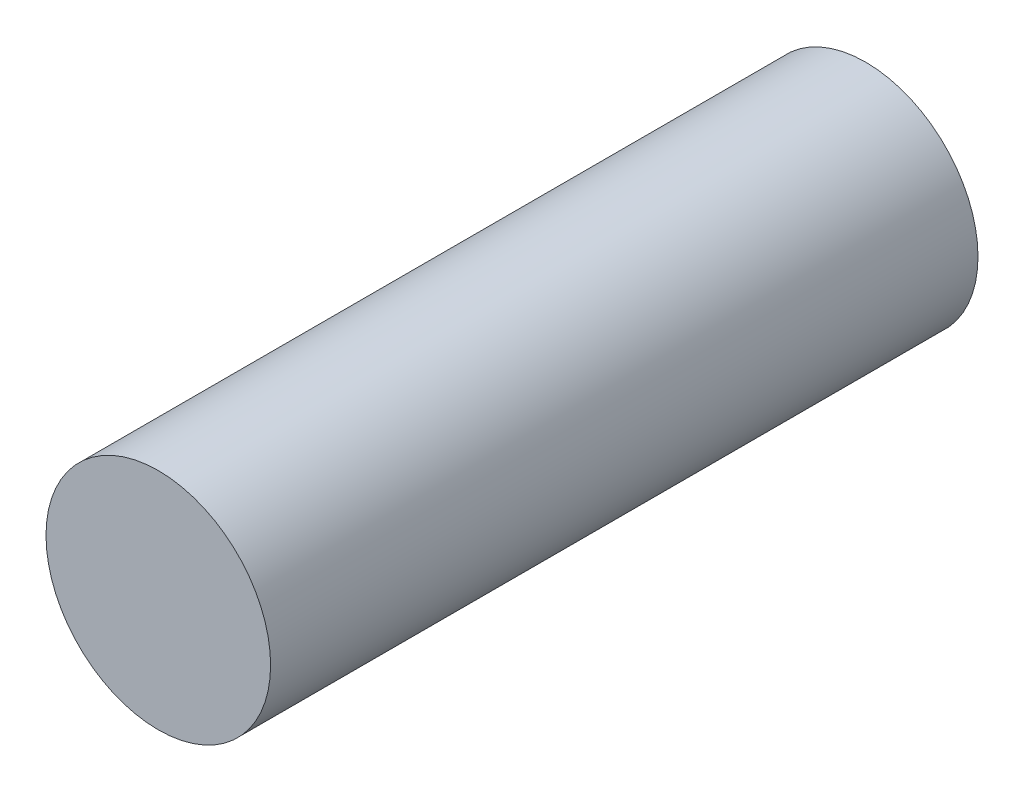
ISO-10303-21;
HEADER;
FILE_DESCRIPTION(('STEP AP214'),'2;1');
FILE_NAME('part.step','',(''),(''),'','','');
FILE_SCHEMA(('AUTOMOTIVE_DESIGN { 1 0 10303 214 1 1 1 1 }'));
ENDSEC;
DATA;
#1=APPLICATION_CONTEXT('core data for automotive mechanical design processes');
#2=APPLICATION_PROTOCOL_DEFINITION('international standard','automotive_design',2000,#1);
#3=PRODUCT_CONTEXT('',#1,'mechanical');
#4=PRODUCT('Part','Part','',(#3));
#5=PRODUCT_RELATED_PRODUCT_CATEGORY('part','',(#4));
#6=PRODUCT_DEFINITION_FORMATION('','',#4);
#7=PRODUCT_DEFINITION_CONTEXT('part definition',#1,'design');
#8=PRODUCT_DEFINITION('design','',#6,#7);
#9=PRODUCT_DEFINITION_SHAPE('','',#8);
#10=(LENGTH_UNIT() NAMED_UNIT(*) SI_UNIT(.MILLI.,.METRE.));
#11=(NAMED_UNIT(*) PLANE_ANGLE_UNIT() SI_UNIT($,.RADIAN.));
#12=(NAMED_UNIT(*) SI_UNIT($,.STERADIAN.) SOLID_ANGLE_UNIT());
#13=UNCERTAINTY_MEASURE_WITH_UNIT(LENGTH_MEASURE(1.E-05),#10,'distance_accuracy_value','');
#14=(GEOMETRIC_REPRESENTATION_CONTEXT(3) GLOBAL_UNCERTAINTY_ASSIGNED_CONTEXT((#13)) GLOBAL_UNIT_ASSIGNED_CONTEXT((#10,
#11,#12)) REPRESENTATION_CONTEXT('',''));
#15=CARTESIAN_POINT('',(0.,0.,0.));
#16=DIRECTION('',(0.,0.,1.));
#17=DIRECTION('',(1.,0.,0.));
#18=AXIS2_PLACEMENT_3D('',#15,#16,#17);
#19=CARTESIAN_POINT('',(0.,0.,40.));
#20=DIRECTION('',(0.,0.,-1.));
#21=DIRECTION('',(-1.,0.,0.));
#22=AXIS2_PLACEMENT_3D('',#19,#20,#21);
#23=CYLINDRICAL_SURFACE('',#22,6.35);
#24=CARTESIAN_POINT('',(0.,0.,40.));
#25=DIRECTION('',(0.,0.,1.));
#26=DIRECTION('',(1.,0.,0.));
#27=AXIS2_PLACEMENT_3D('',#24,#25,#26);
#28=CIRCLE('',#27,6.35);
#29=CARTESIAN_POINT('',(6.35,0.,40.));
#30=VERTEX_POINT('',#29);
#31=EDGE_CURVE('E10',#30,#30,#28,.T.);
#32=ORIENTED_EDGE('',*,*,#31,.F.);
#33=EDGE_LOOP('',(#32));
#34=FACE_BOUND('',#33,.T.);
#35=CARTESIAN_POINT('',(0.,0.,0.));
#36=DIRECTION('',(0.,0.,1.));
#37=DIRECTION('',(1.,0.,0.));
#38=AXIS2_PLACEMENT_3D('',#35,#36,#37);
#39=CIRCLE('',#38,6.35);
#40=CARTESIAN_POINT('',(6.35,0.,0.));
#41=VERTEX_POINT('',#40);
#42=EDGE_CURVE('E46',#41,#41,#39,.T.);
#43=ORIENTED_EDGE('',*,*,#42,.T.);
#44=EDGE_LOOP('',(#43));
#45=FACE_BOUND('',#44,.T.);
#46=ADVANCED_FACE('F43',(#34,#45),#23,.T.);
#47=CARTESIAN_POINT('',(0.,0.,40.));
#48=DIRECTION('',(0.,0.,1.));
#49=DIRECTION('',(1.,0.,0.));
#50=AXIS2_PLACEMENT_3D('',#47,#48,#49);
#51=PLANE('',#50);
#52=ORIENTED_EDGE('',*,*,#31,.T.);
#53=EDGE_LOOP('',(#52));
#54=FACE_BOUND('',#53,.T.);
#55=ADVANCED_FACE('F60',(#54),#51,.T.);
#56=CARTESIAN_POINT('',(0.,0.,0.));
#57=DIRECTION('',(0.,0.,1.));
#58=DIRECTION('',(1.,0.,0.));
#59=AXIS2_PLACEMENT_3D('',#56,#57,#58);
#60=PLANE('',#59);
#61=ORIENTED_EDGE('',*,*,#42,.F.);
#62=EDGE_LOOP('',(#61));
#63=FACE_BOUND('',#62,.T.);
#64=ADVANCED_FACE('F58',(#63),#60,.F.);
#65=CLOSED_SHELL('',(#46,#55,#64));
#66=MANIFOLD_SOLID_BREP('B2',#65);
#67=ADVANCED_BREP_SHAPE_REPRESENTATION('',(#18,#66),#14);
#68=SHAPE_DEFINITION_REPRESENTATION(#9,#67);
ENDSEC;
END-ISO-10303-21;
